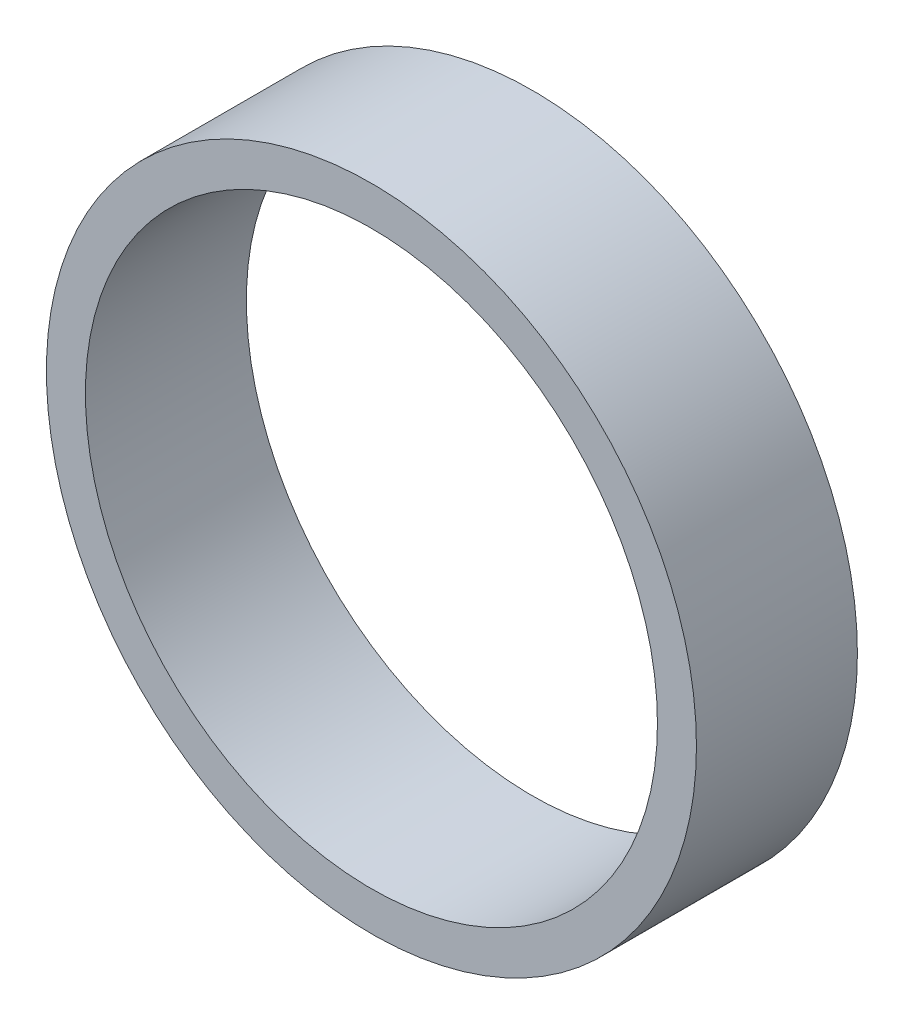
ISO-10303-21;
HEADER;
FILE_DESCRIPTION(('STEP AP214'),'2;1');
FILE_NAME('part.step','',(''),(''),'','','');
FILE_SCHEMA(('AUTOMOTIVE_DESIGN { 1 0 10303 214 1 1 1 1 }'));
ENDSEC;
DATA;
#1=APPLICATION_CONTEXT('core data for automotive mechanical design processes');
#2=APPLICATION_PROTOCOL_DEFINITION('international standard','automotive_design',2000,#1);
#3=PRODUCT_CONTEXT('',#1,'mechanical');
#4=PRODUCT('Part','Part','',(#3));
#5=PRODUCT_RELATED_PRODUCT_CATEGORY('part','',(#4));
#6=PRODUCT_DEFINITION_FORMATION('','',#4);
#7=PRODUCT_DEFINITION_CONTEXT('part definition',#1,'design');
#8=PRODUCT_DEFINITION('design','',#6,#7);
#9=PRODUCT_DEFINITION_SHAPE('','',#8);
#10=(LENGTH_UNIT() NAMED_UNIT(*) SI_UNIT(.MILLI.,.METRE.));
#11=(NAMED_UNIT(*) PLANE_ANGLE_UNIT() SI_UNIT($,.RADIAN.));
#12=(NAMED_UNIT(*) SI_UNIT($,.STERADIAN.) SOLID_ANGLE_UNIT());
#13=UNCERTAINTY_MEASURE_WITH_UNIT(LENGTH_MEASURE(1.E-05),#10,'distance_accuracy_value','');
#14=(GEOMETRIC_REPRESENTATION_CONTEXT(3) GLOBAL_UNCERTAINTY_ASSIGNED_CONTEXT((#13)) GLOBAL_UNIT_ASSIGNED_CONTEXT((#10,
#11,#12)) REPRESENTATION_CONTEXT('',''));
#15=CARTESIAN_POINT('',(0.,0.,0.));
#16=DIRECTION('',(0.,0.,1.));
#17=DIRECTION('',(1.,0.,0.));
#18=AXIS2_PLACEMENT_3D('',#15,#16,#17);
#19=CARTESIAN_POINT('',(0.,0.,-83.0906781186548));
#20=DIRECTION('',(0.,0.,1.));
#21=DIRECTION('',(1.,0.,0.));
#22=AXIS2_PLACEMENT_3D('',#19,#20,#21);
#23=CYLINDRICAL_SURFACE('',#22,25.);
#24=CARTESIAN_POINT('',(0.,0.,-12.38));
#25=DIRECTION('',(0.,0.,1.));
#26=DIRECTION('',(1.,0.,0.));
#27=AXIS2_PLACEMENT_3D('',#24,#25,#26);
#28=CIRCLE('',#27,25.);
#29=CARTESIAN_POINT('',(25.,0.,-12.38));
#30=VERTEX_POINT('',#29);
#31=EDGE_CURVE('E10',#30,#30,#28,.F.);
#32=ORIENTED_EDGE('',*,*,#31,.F.);
#33=EDGE_LOOP('',(#32));
#34=FACE_BOUND('',#33,.T.);
#35=CARTESIAN_POINT('',(0.,0.,0.));
#36=DIRECTION('',(0.,0.,1.));
#37=DIRECTION('',(1.,0.,0.));
#38=AXIS2_PLACEMENT_3D('',#35,#36,#37);
#39=CIRCLE('',#38,25.);
#40=CARTESIAN_POINT('',(25.,0.,0.));
#41=VERTEX_POINT('',#40);
#42=EDGE_CURVE('E42',#41,#41,#39,.T.);
#43=ORIENTED_EDGE('',*,*,#42,.F.);
#44=EDGE_LOOP('',(#43));
#45=FACE_BOUND('',#44,.T.);
#46=ADVANCED_FACE('F31',(#34,#45),#23,.T.);
#47=CARTESIAN_POINT('',(0.,0.,0.));
#48=DIRECTION('',(0.,0.,1.));
#49=DIRECTION('',(1.,0.,0.));
#50=AXIS2_PLACEMENT_3D('',#47,#48,#49);
#51=PLANE('',#50);
#52=CARTESIAN_POINT('',(0.,0.,0.));
#53=DIRECTION('',(0.,0.,1.));
#54=DIRECTION('',(1.,0.,0.));
#55=AXIS2_PLACEMENT_3D('',#52,#53,#54);
#56=CIRCLE('',#55,22.);
#57=CARTESIAN_POINT('',(22.,0.,0.));
#58=VERTEX_POINT('',#57);
#59=EDGE_CURVE('E44',#58,#58,#56,.T.);
#60=ORIENTED_EDGE('',*,*,#59,.F.);
#61=EDGE_LOOP('',(#60));
#62=FACE_BOUND('',#61,.T.);
#63=ORIENTED_EDGE('',*,*,#42,.T.);
#64=EDGE_LOOP('',(#63));
#65=FACE_BOUND('',#64,.T.);
#66=ADVANCED_FACE('F49',(#62,#65),#51,.T.);
#67=CARTESIAN_POINT('',(0.,0.,-83.0906781186548));
#68=DIRECTION('',(0.,0.,1.));
#69=DIRECTION('',(1.,0.,0.));
#70=AXIS2_PLACEMENT_3D('',#67,#68,#69);
#71=CYLINDRICAL_SURFACE('',#70,22.);
#72=CARTESIAN_POINT('',(0.,0.,-12.38));
#73=DIRECTION('',(0.,0.,1.));
#74=DIRECTION('',(1.,0.,0.));
#75=AXIS2_PLACEMENT_3D('',#72,#73,#74);
#76=CIRCLE('',#75,22.);
#77=CARTESIAN_POINT('',(22.,0.,-12.38));
#78=VERTEX_POINT('',#77);
#79=EDGE_CURVE('E34',#78,#78,#76,.F.);
#80=ORIENTED_EDGE('',*,*,#79,.T.);
#81=EDGE_LOOP('',(#80));
#82=FACE_BOUND('',#81,.T.);
#83=ORIENTED_EDGE('',*,*,#59,.T.);
#84=EDGE_LOOP('',(#83));
#85=FACE_BOUND('',#84,.T.);
#86=ADVANCED_FACE('F56',(#82,#85),#71,.F.);
#87=CARTESIAN_POINT('',(0.,0.,-12.38));
#88=DIRECTION('',(0.,0.,1.));
#89=DIRECTION('',(1.,0.,0.));
#90=AXIS2_PLACEMENT_3D('',#87,#88,#89);
#91=PLANE('',#90);
#92=ORIENTED_EDGE('',*,*,#31,.T.);
#93=EDGE_LOOP('',(#92));
#94=FACE_BOUND('',#93,.T.);
#95=ORIENTED_EDGE('',*,*,#79,.F.);
#96=EDGE_LOOP('',(#95));
#97=FACE_BOUND('',#96,.T.);
#98=ADVANCED_FACE('F61',(#94,#97),#91,.F.);
#99=CLOSED_SHELL('',(#46,#66,#86,#98));
#100=MANIFOLD_SOLID_BREP('B2',#99);
#101=ADVANCED_BREP_SHAPE_REPRESENTATION('',(#18,#100),#14);
#102=SHAPE_DEFINITION_REPRESENTATION(#9,#101);
ENDSEC;
END-ISO-10303-21;
